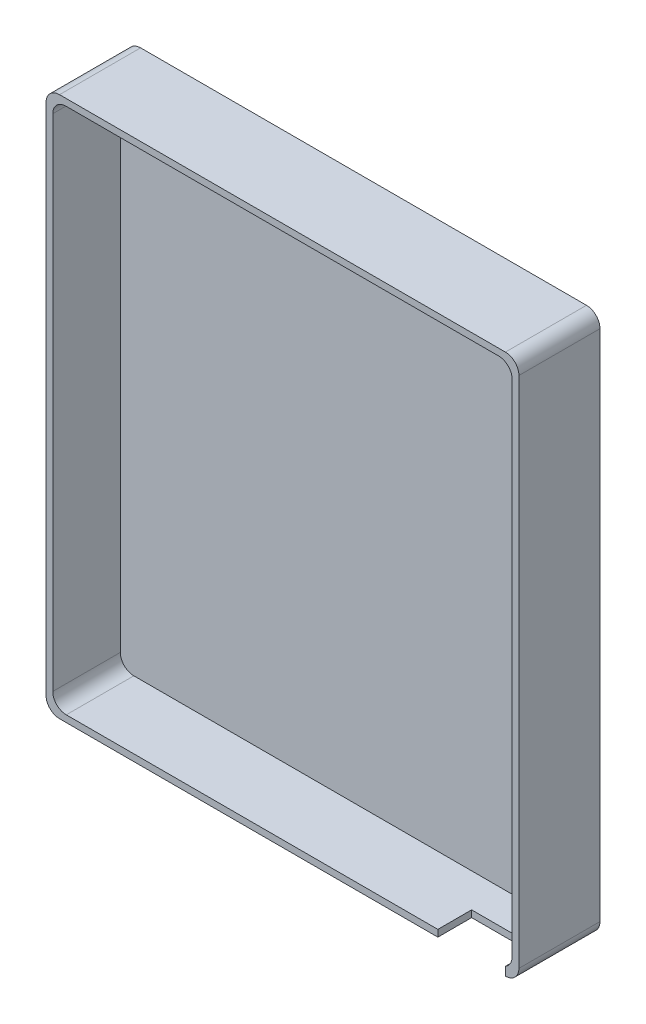
ISO-10303-21;
HEADER;
FILE_DESCRIPTION(('STEP AP214'),'2;1');
FILE_NAME('part.step','',(''),(''),'','','');
FILE_SCHEMA(('AUTOMOTIVE_DESIGN { 1 0 10303 214 1 1 1 1 }'));
ENDSEC;
DATA;
#1=APPLICATION_CONTEXT('core data for automotive mechanical design processes');
#2=APPLICATION_PROTOCOL_DEFINITION('international standard','automotive_design',2000,#1);
#3=PRODUCT_CONTEXT('',#1,'mechanical');
#4=PRODUCT('Part','Part','',(#3));
#5=PRODUCT_RELATED_PRODUCT_CATEGORY('part','',(#4));
#6=PRODUCT_DEFINITION_FORMATION('','',#4);
#7=PRODUCT_DEFINITION_CONTEXT('part definition',#1,'design');
#8=PRODUCT_DEFINITION('design','',#6,#7);
#9=PRODUCT_DEFINITION_SHAPE('','',#8);
#10=(LENGTH_UNIT() NAMED_UNIT(*) SI_UNIT(.MILLI.,.METRE.));
#11=(NAMED_UNIT(*) PLANE_ANGLE_UNIT() SI_UNIT($,.RADIAN.));
#12=(NAMED_UNIT(*) SI_UNIT($,.STERADIAN.) SOLID_ANGLE_UNIT());
#13=UNCERTAINTY_MEASURE_WITH_UNIT(LENGTH_MEASURE(1.E-05),#10,'distance_accuracy_value','');
#14=(GEOMETRIC_REPRESENTATION_CONTEXT(3) GLOBAL_UNCERTAINTY_ASSIGNED_CONTEXT((#13)) GLOBAL_UNIT_ASSIGNED_CONTEXT((#10,
#11,#12)) REPRESENTATION_CONTEXT('',''));
#15=CARTESIAN_POINT('',(0.,0.,0.));
#16=DIRECTION('',(0.,0.,1.));
#17=DIRECTION('',(1.,0.,0.));
#18=AXIS2_PLACEMENT_3D('',#15,#16,#17);
#19=CARTESIAN_POINT('',(0.,0.,2.54));
#20=DIRECTION('',(0.,0.,1.));
#21=DIRECTION('',(1.,0.,0.));
#22=AXIS2_PLACEMENT_3D('',#19,#20,#21);
#23=PLANE('',#22);
#24=CARTESIAN_POINT('',(3.74138412618867,97.8586158738113,2.54));
#25=DIRECTION('',(0.,0.,1.));
#26=DIRECTION('',(1.,0.,0.));
#27=AXIS2_PLACEMENT_3D('',#24,#25,#26);
#28=CIRCLE('',#27,2.47138412618867);
#29=CARTESIAN_POINT('',(1.27,97.8586158738113,2.54));
#30=VERTEX_POINT('',#29);
#31=CARTESIAN_POINT('',(3.74138412618869,100.33,2.54));
#32=VERTEX_POINT('',#31);
#33=EDGE_CURVE('E270',#30,#32,#28,.F.);
#34=ORIENTED_EDGE('',*,*,#33,.F.);
#35=DIRECTION('',(0.,-1.,0.));
#36=VECTOR('',#35,1.);
#37=CARTESIAN_POINT('',(1.27,0.,2.54));
#38=LINE('',#37,#36);
#39=CARTESIAN_POINT('',(1.27,3.81000000000002,2.54));
#40=VERTEX_POINT('',#39);
#41=EDGE_CURVE('E294',#30,#40,#38,.T.);
#42=ORIENTED_EDGE('',*,*,#41,.T.);
#43=CARTESIAN_POINT('',(3.81,3.81,2.54));
#44=DIRECTION('',(0.,0.,1.));
#45=DIRECTION('',(1.,0.,0.));
#46=AXIS2_PLACEMENT_3D('',#43,#44,#45);
#47=CIRCLE('',#46,2.54);
#48=CARTESIAN_POINT('',(3.81000000000002,1.27,2.54));
#49=VERTEX_POINT('',#48);
#50=EDGE_CURVE('E297',#40,#49,#47,.T.);
#51=ORIENTED_EDGE('',*,*,#50,.T.);
#52=DIRECTION('',(1.,0.,0.));
#53=VECTOR('',#52,1.);
#54=CARTESIAN_POINT('',(0.,1.27,2.54));
#55=LINE('',#54,#53);
#56=CARTESIAN_POINT('',(85.09,1.27,2.54));
#57=VERTEX_POINT('',#56);
#58=EDGE_CURVE('E300',#49,#57,#55,.T.);
#59=ORIENTED_EDGE('',*,*,#58,.T.);
#60=CARTESIAN_POINT('',(85.09,3.81,2.54));
#61=DIRECTION('',(0.,0.,1.));
#62=DIRECTION('',(1.,0.,0.));
#63=AXIS2_PLACEMENT_3D('',#60,#61,#62);
#64=CIRCLE('',#63,2.54);
#65=CARTESIAN_POINT('',(87.63,3.81000000000002,2.54));
#66=VERTEX_POINT('',#65);
#67=EDGE_CURVE('E303',#57,#66,#64,.T.);
#68=ORIENTED_EDGE('',*,*,#67,.T.);
#69=DIRECTION('',(0.,1.,0.));
#70=VECTOR('',#69,1.);
#71=CARTESIAN_POINT('',(87.63,0.,2.54));
#72=LINE('',#71,#70);
#73=CARTESIAN_POINT('',(87.63,97.79,2.54));
#74=VERTEX_POINT('',#73);
#75=EDGE_CURVE('E306',#66,#74,#72,.T.);
#76=ORIENTED_EDGE('',*,*,#75,.T.);
#77=CARTESIAN_POINT('',(85.09,97.79,2.54));
#78=DIRECTION('',(0.,0.,1.));
#79=DIRECTION('',(1.,0.,0.));
#80=AXIS2_PLACEMENT_3D('',#77,#78,#79);
#81=CIRCLE('',#80,2.54);
#82=CARTESIAN_POINT('',(85.09,100.33,2.54));
#83=VERTEX_POINT('',#82);
#84=EDGE_CURVE('E309',#74,#83,#81,.T.);
#85=ORIENTED_EDGE('',*,*,#84,.T.);
#86=DIRECTION('',(-1.,0.,0.));
#87=VECTOR('',#86,1.);
#88=CARTESIAN_POINT('',(0.,100.33,2.54));
#89=LINE('',#88,#87);
#90=EDGE_CURVE('E178',#83,#32,#89,.T.);
#91=ORIENTED_EDGE('',*,*,#90,.T.);
#92=EDGE_LOOP('',(#34,#42,#51,#59,#68,#76,#85,#91));
#93=FACE_BOUND('',#92,.T.);
#94=ADVANCED_FACE('F38',(#93),#23,.T.);
#95=CARTESIAN_POINT('',(1.27,0.,15.24));
#96=DIRECTION('',(1.,0.,0.));
#97=DIRECTION('',(0.,0.,-1.));
#98=AXIS2_PLACEMENT_3D('',#95,#96,#97);
#99=PLANE('',#98);
#100=DIRECTION('',(0.,0.,-1.));
#101=VECTOR('',#100,1.);
#102=CARTESIAN_POINT('',(1.27,3.81000000000002,15.24));
#103=LINE('',#102,#101);
#104=CARTESIAN_POINT('',(1.27,3.81000000000002,15.24));
#105=VERTEX_POINT('',#104);
#106=EDGE_CURVE('E248',#105,#40,#103,.T.);
#107=ORIENTED_EDGE('',*,*,#106,.T.);
#108=ORIENTED_EDGE('',*,*,#41,.F.);
#109=DIRECTION('',(0.,0.,-1.));
#110=VECTOR('',#109,1.);
#111=CARTESIAN_POINT('',(1.27,97.8586158738113,15.24));
#112=LINE('',#111,#110);
#113=CARTESIAN_POINT('',(1.27,97.8586158738113,15.24));
#114=VERTEX_POINT('',#113);
#115=EDGE_CURVE('E267',#114,#30,#112,.T.);
#116=ORIENTED_EDGE('',*,*,#115,.F.);
#117=DIRECTION('',(0.,-1.,0.));
#118=VECTOR('',#117,1.);
#119=CARTESIAN_POINT('',(1.27,0.,15.24));
#120=LINE('',#119,#118);
#121=EDGE_CURVE('E208',#114,#105,#120,.T.);
#122=ORIENTED_EDGE('',*,*,#121,.T.);
#123=EDGE_LOOP('',(#107,#108,#116,#122));
#124=FACE_BOUND('',#123,.T.);
#125=ADVANCED_FACE('F380',(#124),#99,.T.);
#126=CARTESIAN_POINT('',(3.74138412618867,97.8586158738113,15.24));
#127=DIRECTION('',(0.,0.,-1.));
#128=DIRECTION('',(-1.,0.,0.));
#129=AXIS2_PLACEMENT_3D('',#126,#127,#128);
#130=CYLINDRICAL_SURFACE('',#129,2.47138412618867);
#131=ORIENTED_EDGE('',*,*,#33,.T.);
#132=DIRECTION('',(0.,0.,-1.));
#133=VECTOR('',#132,1.);
#134=CARTESIAN_POINT('',(3.74138412618869,100.33,15.24));
#135=LINE('',#134,#133);
#136=CARTESIAN_POINT('',(3.74138412618869,100.33,15.24));
#137=VERTEX_POINT('',#136);
#138=EDGE_CURVE('E264',#137,#32,#135,.T.);
#139=ORIENTED_EDGE('',*,*,#138,.F.);
#140=CARTESIAN_POINT('',(3.74138412618867,97.8586158738113,15.24));
#141=DIRECTION('',(0.,0.,1.));
#142=DIRECTION('',(1.,0.,0.));
#143=AXIS2_PLACEMENT_3D('',#140,#141,#142);
#144=CIRCLE('',#143,2.47138412618867);
#145=EDGE_CURVE('E211',#114,#137,#144,.F.);
#146=ORIENTED_EDGE('',*,*,#145,.F.);
#147=ORIENTED_EDGE('',*,*,#115,.T.);
#148=EDGE_LOOP('',(#131,#139,#146,#147));
#149=FACE_BOUND('',#148,.T.);
#150=ADVANCED_FACE('F383',(#149),#130,.F.);
#151=CARTESIAN_POINT('',(0.,100.33,15.24));
#152=DIRECTION('',(0.,-1.,0.));
#153=DIRECTION('',(0.,0.,-1.));
#154=AXIS2_PLACEMENT_3D('',#151,#152,#153);
#155=PLANE('',#154);
#156=ORIENTED_EDGE('',*,*,#138,.T.);
#157=ORIENTED_EDGE('',*,*,#90,.F.);
#158=DIRECTION('',(0.,0.,-1.));
#159=VECTOR('',#158,1.);
#160=CARTESIAN_POINT('',(85.09,100.33,15.24));
#161=LINE('',#160,#159);
#162=CARTESIAN_POINT('',(85.09,100.33,15.24));
#163=VERTEX_POINT('',#162);
#164=EDGE_CURVE('E261',#163,#83,#161,.T.);
#165=ORIENTED_EDGE('',*,*,#164,.F.);
#166=DIRECTION('',(-1.,0.,0.));
#167=VECTOR('',#166,1.);
#168=CARTESIAN_POINT('',(0.,100.33,15.24));
#169=LINE('',#168,#167);
#170=EDGE_CURVE('E213',#163,#137,#169,.T.);
#171=ORIENTED_EDGE('',*,*,#170,.T.);
#172=EDGE_LOOP('',(#156,#157,#165,#171));
#173=FACE_BOUND('',#172,.T.);
#174=ADVANCED_FACE('F316',(#173),#155,.T.);
#175=CARTESIAN_POINT('',(85.09,97.79,15.24));
#176=DIRECTION('',(0.,0.,-1.));
#177=DIRECTION('',(-1.,0.,0.));
#178=AXIS2_PLACEMENT_3D('',#175,#176,#177);
#179=CYLINDRICAL_SURFACE('',#178,2.54);
#180=ORIENTED_EDGE('',*,*,#164,.T.);
#181=ORIENTED_EDGE('',*,*,#84,.F.);
#182=DIRECTION('',(0.,0.,-1.));
#183=VECTOR('',#182,1.);
#184=CARTESIAN_POINT('',(87.63,97.79,15.24));
#185=LINE('',#184,#183);
#186=CARTESIAN_POINT('',(87.63,97.79,15.24));
#187=VERTEX_POINT('',#186);
#188=EDGE_CURVE('E258',#187,#74,#185,.T.);
#189=ORIENTED_EDGE('',*,*,#188,.F.);
#190=CARTESIAN_POINT('',(85.09,97.79,15.24));
#191=DIRECTION('',(0.,0.,1.));
#192=DIRECTION('',(1.,0.,0.));
#193=AXIS2_PLACEMENT_3D('',#190,#191,#192);
#194=CIRCLE('',#193,2.54);
#195=EDGE_CURVE('E216',#187,#163,#194,.T.);
#196=ORIENTED_EDGE('',*,*,#195,.T.);
#197=EDGE_LOOP('',(#180,#181,#189,#196));
#198=FACE_BOUND('',#197,.T.);
#199=ADVANCED_FACE('F320',(#198),#179,.F.);
#200=CARTESIAN_POINT('',(87.63,0.,15.24));
#201=DIRECTION('',(-1.,0.,0.));
#202=DIRECTION('',(0.,0.,1.));
#203=AXIS2_PLACEMENT_3D('',#200,#201,#202);
#204=PLANE('',#203);
#205=ORIENTED_EDGE('',*,*,#188,.T.);
#206=ORIENTED_EDGE('',*,*,#75,.F.);
#207=DIRECTION('',(0.,0.,-1.));
#208=VECTOR('',#207,1.);
#209=CARTESIAN_POINT('',(87.63,3.81000000000002,15.24));
#210=LINE('',#209,#208);
#211=CARTESIAN_POINT('',(87.63,3.81000000000002,15.24));
#212=VERTEX_POINT('',#211);
#213=EDGE_CURVE('E255',#212,#66,#210,.T.);
#214=ORIENTED_EDGE('',*,*,#213,.F.);
#215=DIRECTION('',(0.,1.,0.));
#216=VECTOR('',#215,1.);
#217=CARTESIAN_POINT('',(87.63,0.,15.24));
#218=LINE('',#217,#216);
#219=EDGE_CURVE('E219',#212,#187,#218,.T.);
#220=ORIENTED_EDGE('',*,*,#219,.T.);
#221=EDGE_LOOP('',(#205,#206,#214,#220));
#222=FACE_BOUND('',#221,.T.);
#223=ADVANCED_FACE('F326',(#222),#204,.T.);
#224=CARTESIAN_POINT('',(85.09,3.81,15.24));
#225=DIRECTION('',(0.,0.,-1.));
#226=DIRECTION('',(-1.,0.,0.));
#227=AXIS2_PLACEMENT_3D('',#224,#225,#226);
#228=CYLINDRICAL_SURFACE('',#227,2.54);
#229=DIRECTION('',(0.,0.,-1.));
#230=VECTOR('',#229,1.);
#231=CARTESIAN_POINT('',(86.36,1.61029547438753,15.24));
#232=LINE('',#231,#230);
#233=CARTESIAN_POINT('',(86.36,1.61029547438753,15.24));
#234=VERTEX_POINT('',#233);
#235=CARTESIAN_POINT('',(86.36,1.61029547438752,8.89));
#236=VERTEX_POINT('',#235);
#237=EDGE_CURVE('E337',#234,#236,#232,.T.);
#238=ORIENTED_EDGE('',*,*,#237,.F.);
#239=CARTESIAN_POINT('',(85.09,3.81,15.24));
#240=DIRECTION('',(0.,0.,1.));
#241=DIRECTION('',(1.,0.,0.));
#242=AXIS2_PLACEMENT_3D('',#239,#240,#241);
#243=CIRCLE('',#242,2.54);
#244=EDGE_CURVE('E222',#234,#212,#243,.T.);
#245=ORIENTED_EDGE('',*,*,#244,.T.);
#246=ORIENTED_EDGE('',*,*,#213,.T.);
#247=ORIENTED_EDGE('',*,*,#67,.F.);
#248=DIRECTION('',(0.,0.,-1.));
#249=VECTOR('',#248,1.);
#250=CARTESIAN_POINT('',(85.09,1.27,15.24));
#251=LINE('',#250,#249);
#252=CARTESIAN_POINT('',(85.09,1.27,8.89));
#253=VERTEX_POINT('',#252);
#254=EDGE_CURVE('E253',#253,#57,#251,.T.);
#255=ORIENTED_EDGE('',*,*,#254,.F.);
#256=CARTESIAN_POINT('',(85.09,3.81,8.89));
#257=DIRECTION('',(0.,0.,-1.));
#258=DIRECTION('',(-1.,0.,0.));
#259=AXIS2_PLACEMENT_3D('',#256,#257,#258);
#260=CIRCLE('',#259,2.54);
#261=EDGE_CURVE('E233',#236,#253,#260,.T.);
#262=ORIENTED_EDGE('',*,*,#261,.F.);
#263=EDGE_LOOP('',(#238,#245,#246,#247,#255,#262));
#264=FACE_BOUND('',#263,.T.);
#265=ADVANCED_FACE('F330',(#264),#228,.F.);
#266=CARTESIAN_POINT('',(0.,1.27,15.24));
#267=DIRECTION('',(0.,1.,0.));
#268=DIRECTION('',(0.,0.,1.));
#269=AXIS2_PLACEMENT_3D('',#266,#267,#268);
#270=PLANE('',#269);
#271=DIRECTION('',(-1.,0.,0.));
#272=VECTOR('',#271,1.);
#273=CARTESIAN_POINT('',(0.,1.27,8.89));
#274=LINE('',#273,#272);
#275=CARTESIAN_POINT('',(73.66,1.27,8.89));
#276=VERTEX_POINT('',#275);
#277=EDGE_CURVE('E335',#253,#276,#274,.T.);
#278=ORIENTED_EDGE('',*,*,#277,.F.);
#279=ORIENTED_EDGE('',*,*,#254,.T.);
#280=ORIENTED_EDGE('',*,*,#58,.F.);
#281=DIRECTION('',(0.,0.,-1.));
#282=VECTOR('',#281,1.);
#283=CARTESIAN_POINT('',(3.81000000000002,1.27,15.24));
#284=LINE('',#283,#282);
#285=CARTESIAN_POINT('',(3.81000000000002,1.27,15.24));
#286=VERTEX_POINT('',#285);
#287=EDGE_CURVE('E61',#286,#49,#284,.T.);
#288=ORIENTED_EDGE('',*,*,#287,.F.);
#289=DIRECTION('',(1.,0.,0.));
#290=VECTOR('',#289,1.);
#291=CARTESIAN_POINT('',(0.,1.27,15.24));
#292=LINE('',#291,#290);
#293=CARTESIAN_POINT('',(73.66,1.27,15.24));
#294=VERTEX_POINT('',#293);
#295=EDGE_CURVE('E224',#286,#294,#292,.T.);
#296=ORIENTED_EDGE('',*,*,#295,.T.);
#297=DIRECTION('',(0.,0.,1.));
#298=VECTOR('',#297,1.);
#299=CARTESIAN_POINT('',(73.66,1.27,15.24));
#300=LINE('',#299,#298);
#301=EDGE_CURVE('E53',#276,#294,#300,.T.);
#302=ORIENTED_EDGE('',*,*,#301,.F.);
#303=EDGE_LOOP('',(#278,#279,#280,#288,#296,#302));
#304=FACE_BOUND('',#303,.T.);
#305=ADVANCED_FACE('F334',(#304),#270,.T.);
#306=CARTESIAN_POINT('',(0.,0.,15.24));
#307=DIRECTION('',(1.,0.,0.));
#308=DIRECTION('',(0.,0.,-1.));
#309=AXIS2_PLACEMENT_3D('',#306,#307,#308);
#310=PLANE('',#309);
#311=DIRECTION('',(0.,-1.,0.));
#312=VECTOR('',#311,1.);
#313=CARTESIAN_POINT('',(0.,0.,0.));
#314=LINE('',#313,#312);
#315=CARTESIAN_POINT('',(0.,99.06,0.));
#316=VERTEX_POINT('',#315);
#317=CARTESIAN_POINT('',(0.,2.54000000000002,0.));
#318=VERTEX_POINT('',#317);
#319=EDGE_CURVE('E229',#316,#318,#314,.T.);
#320=ORIENTED_EDGE('',*,*,#319,.T.);
#321=DIRECTION('',(0.,0.,-1.));
#322=VECTOR('',#321,1.);
#323=CARTESIAN_POINT('',(0.,2.54000000000002,15.24));
#324=LINE('',#323,#322);
#325=CARTESIAN_POINT('',(0.,2.54000000000002,15.24));
#326=VERTEX_POINT('',#325);
#327=EDGE_CURVE('E251',#326,#318,#324,.T.);
#328=ORIENTED_EDGE('',*,*,#327,.F.);
#329=DIRECTION('',(0.,-1.,0.));
#330=VECTOR('',#329,1.);
#331=CARTESIAN_POINT('',(0.,0.,15.24));
#332=LINE('',#331,#330);
#333=CARTESIAN_POINT('',(0.,99.06,15.24));
#334=VERTEX_POINT('',#333);
#335=EDGE_CURVE('E197',#334,#326,#332,.T.);
#336=ORIENTED_EDGE('',*,*,#335,.F.);
#337=DIRECTION('',(0.,0.,-1.));
#338=VECTOR('',#337,1.);
#339=CARTESIAN_POINT('',(0.,99.06,15.24));
#340=LINE('',#339,#338);
#341=EDGE_CURVE('E228',#334,#316,#340,.T.);
#342=ORIENTED_EDGE('',*,*,#341,.T.);
#343=EDGE_LOOP('',(#320,#328,#336,#342));
#344=FACE_BOUND('',#343,.T.);
#345=ADVANCED_FACE('F348',(#344),#310,.F.);
#346=CARTESIAN_POINT('',(2.54,2.54,15.24));
#347=DIRECTION('',(0.,0.,-1.));
#348=DIRECTION('',(-1.,0.,0.));
#349=AXIS2_PLACEMENT_3D('',#346,#347,#348);
#350=CYLINDRICAL_SURFACE('',#349,2.54);
#351=CARTESIAN_POINT('',(2.54,2.54,0.));
#352=DIRECTION('',(0.,0.,1.));
#353=DIRECTION('',(1.,0.,0.));
#354=AXIS2_PLACEMENT_3D('',#351,#352,#353);
#355=CIRCLE('',#354,2.54);
#356=CARTESIAN_POINT('',(2.54000000000002,0.,0.));
#357=VERTEX_POINT('',#356);
#358=EDGE_CURVE('E232',#318,#357,#355,.T.);
#359=ORIENTED_EDGE('',*,*,#358,.T.);
#360=DIRECTION('',(0.,0.,-1.));
#361=VECTOR('',#360,1.);
#362=CARTESIAN_POINT('',(2.54000000000002,0.,15.24));
#363=LINE('',#362,#361);
#364=CARTESIAN_POINT('',(2.54000000000002,0.,15.24));
#365=VERTEX_POINT('',#364);
#366=EDGE_CURVE('E289',#365,#357,#363,.T.);
#367=ORIENTED_EDGE('',*,*,#366,.F.);
#368=CARTESIAN_POINT('',(2.54,2.54,15.24));
#369=DIRECTION('',(0.,0.,1.));
#370=DIRECTION('',(1.,0.,0.));
#371=AXIS2_PLACEMENT_3D('',#368,#369,#370);
#372=CIRCLE('',#371,2.54);
#373=EDGE_CURVE('E191',#326,#365,#372,.T.);
#374=ORIENTED_EDGE('',*,*,#373,.F.);
#375=ORIENTED_EDGE('',*,*,#327,.T.);
#376=EDGE_LOOP('',(#359,#367,#374,#375));
#377=FACE_BOUND('',#376,.T.);
#378=ADVANCED_FACE('F351',(#377),#350,.T.);
#379=CARTESIAN_POINT('',(0.,0.,15.24));
#380=DIRECTION('',(0.,1.,0.));
#381=DIRECTION('',(0.,0.,1.));
#382=AXIS2_PLACEMENT_3D('',#379,#380,#381);
#383=PLANE('',#382);
#384=DIRECTION('',(0.,0.,-1.));
#385=VECTOR('',#384,1.);
#386=CARTESIAN_POINT('',(86.36,0.,15.24));
#387=LINE('',#386,#385);
#388=CARTESIAN_POINT('',(86.36,0.,8.89));
#389=VERTEX_POINT('',#388);
#390=CARTESIAN_POINT('',(86.36,0.,0.));
#391=VERTEX_POINT('',#390);
#392=EDGE_CURVE('E285',#389,#391,#387,.T.);
#393=ORIENTED_EDGE('',*,*,#392,.F.);
#394=DIRECTION('',(1.,0.,0.));
#395=VECTOR('',#394,1.);
#396=CARTESIAN_POINT('',(73.66,0.,8.89));
#397=LINE('',#396,#395);
#398=CARTESIAN_POINT('',(73.66,0.,8.89));
#399=VERTEX_POINT('',#398);
#400=EDGE_CURVE('E186',#399,#389,#397,.T.);
#401=ORIENTED_EDGE('',*,*,#400,.F.);
#402=DIRECTION('',(0.,0.,-1.));
#403=VECTOR('',#402,1.);
#404=CARTESIAN_POINT('',(73.66,0.,8.89));
#405=LINE('',#404,#403);
#406=CARTESIAN_POINT('',(73.66,0.,15.24));
#407=VERTEX_POINT('',#406);
#408=EDGE_CURVE('E172',#407,#399,#405,.T.);
#409=ORIENTED_EDGE('',*,*,#408,.F.);
#410=DIRECTION('',(1.,0.,0.));
#411=VECTOR('',#410,1.);
#412=CARTESIAN_POINT('',(0.,0.,15.24));
#413=LINE('',#412,#411);
#414=EDGE_CURVE('E184',#365,#407,#413,.T.);
#415=ORIENTED_EDGE('',*,*,#414,.F.);
#416=ORIENTED_EDGE('',*,*,#366,.T.);
#417=DIRECTION('',(1.,0.,0.));
#418=VECTOR('',#417,1.);
#419=CARTESIAN_POINT('',(0.,0.,0.));
#420=LINE('',#419,#418);
#421=EDGE_CURVE('E235',#357,#391,#420,.T.);
#422=ORIENTED_EDGE('',*,*,#421,.T.);
#423=EDGE_LOOP('',(#393,#401,#409,#415,#416,#422));
#424=FACE_BOUND('',#423,.T.);
#425=ADVANCED_FACE('F182',(#424),#383,.F.);
#426=CARTESIAN_POINT('',(86.36,2.54,15.24));
#427=DIRECTION('',(0.,0.,-1.));
#428=DIRECTION('',(-1.,0.,0.));
#429=AXIS2_PLACEMENT_3D('',#426,#427,#428);
#430=CYLINDRICAL_SURFACE('',#429,2.54);
#431=CARTESIAN_POINT('',(86.36,2.54,0.));
#432=DIRECTION('',(0.,0.,1.));
#433=DIRECTION('',(1.,0.,0.));
#434=AXIS2_PLACEMENT_3D('',#431,#432,#433);
#435=CIRCLE('',#434,2.54);
#436=CARTESIAN_POINT('',(88.9,2.54000000000002,0.));
#437=VERTEX_POINT('',#436);
#438=EDGE_CURVE('E238',#391,#437,#435,.T.);
#439=ORIENTED_EDGE('',*,*,#438,.T.);
#440=DIRECTION('',(0.,0.,-1.));
#441=VECTOR('',#440,1.);
#442=CARTESIAN_POINT('',(88.9,2.54000000000002,15.24));
#443=LINE('',#442,#441);
#444=CARTESIAN_POINT('',(88.9,2.54000000000002,15.24));
#445=VERTEX_POINT('',#444);
#446=EDGE_CURVE('E282',#445,#437,#443,.T.);
#447=ORIENTED_EDGE('',*,*,#446,.F.);
#448=CARTESIAN_POINT('',(86.36,2.54,15.24));
#449=DIRECTION('',(0.,0.,1.));
#450=DIRECTION('',(1.,0.,0.));
#451=AXIS2_PLACEMENT_3D('',#448,#449,#450);
#452=CIRCLE('',#451,2.54);
#453=CARTESIAN_POINT('',(86.36,0.,15.24));
#454=VERTEX_POINT('',#453);
#455=EDGE_CURVE('E193',#454,#445,#452,.T.);
#456=ORIENTED_EDGE('',*,*,#455,.F.);
#457=EDGE_CURVE('E286',#454,#389,#387,.T.);
#458=ORIENTED_EDGE('',*,*,#457,.T.);
#459=ORIENTED_EDGE('',*,*,#392,.T.);
#460=EDGE_LOOP('',(#439,#447,#456,#458,#459));
#461=FACE_BOUND('',#460,.T.);
#462=ADVANCED_FACE('F359',(#461),#430,.T.);
#463=CARTESIAN_POINT('',(88.9,0.,15.24));
#464=DIRECTION('',(-1.,0.,0.));
#465=DIRECTION('',(0.,0.,1.));
#466=AXIS2_PLACEMENT_3D('',#463,#464,#465);
#467=PLANE('',#466);
#468=DIRECTION('',(0.,1.,0.));
#469=VECTOR('',#468,1.);
#470=CARTESIAN_POINT('',(88.9,0.,0.));
#471=LINE('',#470,#469);
#472=CARTESIAN_POINT('',(88.9,99.06,0.));
#473=VERTEX_POINT('',#472);
#474=EDGE_CURVE('E240',#437,#473,#471,.T.);
#475=ORIENTED_EDGE('',*,*,#474,.T.);
#476=DIRECTION('',(0.,0.,-1.));
#477=VECTOR('',#476,1.);
#478=CARTESIAN_POINT('',(88.9,99.06,15.24));
#479=LINE('',#478,#477);
#480=CARTESIAN_POINT('',(88.9,99.06,15.24));
#481=VERTEX_POINT('',#480);
#482=EDGE_CURVE('E279',#481,#473,#479,.T.);
#483=ORIENTED_EDGE('',*,*,#482,.F.);
#484=DIRECTION('',(0.,1.,0.));
#485=VECTOR('',#484,1.);
#486=CARTESIAN_POINT('',(88.9,0.,15.24));
#487=LINE('',#486,#485);
#488=EDGE_CURVE('E195',#445,#481,#487,.T.);
#489=ORIENTED_EDGE('',*,*,#488,.F.);
#490=ORIENTED_EDGE('',*,*,#446,.T.);
#491=EDGE_LOOP('',(#475,#483,#489,#490));
#492=FACE_BOUND('',#491,.T.);
#493=ADVANCED_FACE('F363',(#492),#467,.F.);
#494=CARTESIAN_POINT('',(86.36,99.06,15.24));
#495=DIRECTION('',(0.,0.,-1.));
#496=DIRECTION('',(-1.,0.,0.));
#497=AXIS2_PLACEMENT_3D('',#494,#495,#496);
#498=CYLINDRICAL_SURFACE('',#497,2.54);
#499=CARTESIAN_POINT('',(86.36,99.06,0.));
#500=DIRECTION('',(0.,0.,1.));
#501=DIRECTION('',(1.,0.,0.));
#502=AXIS2_PLACEMENT_3D('',#499,#500,#501);
#503=CIRCLE('',#502,2.54);
#504=CARTESIAN_POINT('',(86.36,101.6,0.));
#505=VERTEX_POINT('',#504);
#506=EDGE_CURVE('E242',#473,#505,#503,.T.);
#507=ORIENTED_EDGE('',*,*,#506,.T.);
#508=DIRECTION('',(0.,0.,-1.));
#509=VECTOR('',#508,1.);
#510=CARTESIAN_POINT('',(86.36,101.6,15.24));
#511=LINE('',#510,#509);
#512=CARTESIAN_POINT('',(86.36,101.6,15.24));
#513=VERTEX_POINT('',#512);
#514=EDGE_CURVE('E276',#513,#505,#511,.T.);
#515=ORIENTED_EDGE('',*,*,#514,.F.);
#516=CARTESIAN_POINT('',(86.36,99.06,15.24));
#517=DIRECTION('',(0.,0.,1.));
#518=DIRECTION('',(1.,0.,0.));
#519=AXIS2_PLACEMENT_3D('',#516,#517,#518);
#520=CIRCLE('',#519,2.54);
#521=EDGE_CURVE('E202',#481,#513,#520,.T.);
#522=ORIENTED_EDGE('',*,*,#521,.F.);
#523=ORIENTED_EDGE('',*,*,#482,.T.);
#524=EDGE_LOOP('',(#507,#515,#522,#523));
#525=FACE_BOUND('',#524,.T.);
#526=ADVANCED_FACE('F406',(#525),#498,.T.);
#527=CARTESIAN_POINT('',(0.,101.6,15.24));
#528=DIRECTION('',(0.,-1.,0.));
#529=DIRECTION('',(0.,0.,-1.));
#530=AXIS2_PLACEMENT_3D('',#527,#528,#529);
#531=PLANE('',#530);
#532=DIRECTION('',(-1.,0.,0.));
#533=VECTOR('',#532,1.);
#534=CARTESIAN_POINT('',(0.,101.6,0.));
#535=LINE('',#534,#533);
#536=CARTESIAN_POINT('',(2.54000000000002,101.6,0.));
#537=VERTEX_POINT('',#536);
#538=EDGE_CURVE('E244',#505,#537,#535,.T.);
#539=ORIENTED_EDGE('',*,*,#538,.T.);
#540=DIRECTION('',(0.,0.,-1.));
#541=VECTOR('',#540,1.);
#542=CARTESIAN_POINT('',(2.54000000000002,101.6,15.24));
#543=LINE('',#542,#541);
#544=CARTESIAN_POINT('',(2.54000000000002,101.6,15.24));
#545=VERTEX_POINT('',#544);
#546=EDGE_CURVE('E273',#545,#537,#543,.T.);
#547=ORIENTED_EDGE('',*,*,#546,.F.);
#548=DIRECTION('',(-1.,0.,0.));
#549=VECTOR('',#548,1.);
#550=CARTESIAN_POINT('',(0.,101.6,15.24));
#551=LINE('',#550,#549);
#552=EDGE_CURVE('E204',#513,#545,#551,.T.);
#553=ORIENTED_EDGE('',*,*,#552,.F.);
#554=ORIENTED_EDGE('',*,*,#514,.T.);
#555=EDGE_LOOP('',(#539,#547,#553,#554));
#556=FACE_BOUND('',#555,.T.);
#557=ADVANCED_FACE('F409',(#556),#531,.F.);
#558=CARTESIAN_POINT('',(2.54,99.06,15.24));
#559=DIRECTION('',(0.,0.,-1.));
#560=DIRECTION('',(-1.,0.,0.));
#561=AXIS2_PLACEMENT_3D('',#558,#559,#560);
#562=CYLINDRICAL_SURFACE('',#561,2.54);
#563=CARTESIAN_POINT('',(2.54,99.06,0.));
#564=DIRECTION('',(0.,0.,1.));
#565=DIRECTION('',(1.,0.,0.));
#566=AXIS2_PLACEMENT_3D('',#563,#564,#565);
#567=CIRCLE('',#566,2.54);
#568=EDGE_CURVE('E246',#537,#316,#567,.T.);
#569=ORIENTED_EDGE('',*,*,#568,.T.);
#570=ORIENTED_EDGE('',*,*,#341,.F.);
#571=CARTESIAN_POINT('',(2.54,99.06,15.24));
#572=DIRECTION('',(0.,0.,1.));
#573=DIRECTION('',(1.,0.,0.));
#574=AXIS2_PLACEMENT_3D('',#571,#572,#573);
#575=CIRCLE('',#574,2.54);
#576=EDGE_CURVE('E206',#545,#334,#575,.T.);
#577=ORIENTED_EDGE('',*,*,#576,.F.);
#578=ORIENTED_EDGE('',*,*,#546,.T.);
#579=EDGE_LOOP('',(#569,#570,#577,#578));
#580=FACE_BOUND('',#579,.T.);
#581=ADVANCED_FACE('F413',(#580),#562,.T.);
#582=CARTESIAN_POINT('',(3.81,3.81,15.24));
#583=DIRECTION('',(0.,0.,-1.));
#584=DIRECTION('',(-1.,0.,0.));
#585=AXIS2_PLACEMENT_3D('',#582,#583,#584);
#586=CYLINDRICAL_SURFACE('',#585,2.54);
#587=ORIENTED_EDGE('',*,*,#287,.T.);
#588=ORIENTED_EDGE('',*,*,#50,.F.);
#589=ORIENTED_EDGE('',*,*,#106,.F.);
#590=CARTESIAN_POINT('',(3.81,3.81,15.24));
#591=DIRECTION('',(0.,0.,1.));
#592=DIRECTION('',(1.,0.,0.));
#593=AXIS2_PLACEMENT_3D('',#590,#591,#592);
#594=CIRCLE('',#593,2.54);
#595=EDGE_CURVE('E226',#105,#286,#594,.T.);
#596=ORIENTED_EDGE('',*,*,#595,.T.);
#597=EDGE_LOOP('',(#587,#588,#589,#596));
#598=FACE_BOUND('',#597,.T.);
#599=ADVANCED_FACE('F378',(#598),#586,.F.);
#600=CARTESIAN_POINT('',(0.,0.,15.24));
#601=DIRECTION('',(0.,0.,1.));
#602=DIRECTION('',(1.,0.,0.));
#603=AXIS2_PLACEMENT_3D('',#600,#601,#602);
#604=PLANE('',#603);
#605=DIRECTION('',(0.,1.,0.));
#606=VECTOR('',#605,1.);
#607=CARTESIAN_POINT('',(86.36,0.,15.24));
#608=LINE('',#607,#606);
#609=EDGE_CURVE('E11',#454,#234,#608,.T.);
#610=ORIENTED_EDGE('',*,*,#609,.F.);
#611=ORIENTED_EDGE('',*,*,#455,.T.);
#612=ORIENTED_EDGE('',*,*,#488,.T.);
#613=ORIENTED_EDGE('',*,*,#521,.T.);
#614=ORIENTED_EDGE('',*,*,#552,.T.);
#615=ORIENTED_EDGE('',*,*,#576,.T.);
#616=ORIENTED_EDGE('',*,*,#335,.T.);
#617=ORIENTED_EDGE('',*,*,#373,.T.);
#618=ORIENTED_EDGE('',*,*,#414,.T.);
#619=DIRECTION('',(0.,-1.,0.));
#620=VECTOR('',#619,1.);
#621=CARTESIAN_POINT('',(73.66,0.,15.24));
#622=LINE('',#621,#620);
#623=EDGE_CURVE('E46',#294,#407,#622,.T.);
#624=ORIENTED_EDGE('',*,*,#623,.F.);
#625=ORIENTED_EDGE('',*,*,#295,.F.);
#626=ORIENTED_EDGE('',*,*,#595,.F.);
#627=ORIENTED_EDGE('',*,*,#121,.F.);
#628=ORIENTED_EDGE('',*,*,#145,.T.);
#629=ORIENTED_EDGE('',*,*,#170,.F.);
#630=ORIENTED_EDGE('',*,*,#195,.F.);
#631=ORIENTED_EDGE('',*,*,#219,.F.);
#632=ORIENTED_EDGE('',*,*,#244,.F.);
#633=EDGE_LOOP('',(#610,#611,#612,#613,#614,#615,#616,#617,#618,#624,#625,#626,#627,#628,#629,
#630,#631,#632));
#634=FACE_BOUND('',#633,.T.);
#635=ADVANCED_FACE('F189',(#634),#604,.T.);
#636=CARTESIAN_POINT('',(0.,0.,0.));
#637=DIRECTION('',(0.,0.,1.));
#638=DIRECTION('',(1.,0.,0.));
#639=AXIS2_PLACEMENT_3D('',#636,#637,#638);
#640=PLANE('',#639);
#641=ORIENTED_EDGE('',*,*,#319,.F.);
#642=ORIENTED_EDGE('',*,*,#568,.F.);
#643=ORIENTED_EDGE('',*,*,#538,.F.);
#644=ORIENTED_EDGE('',*,*,#506,.F.);
#645=ORIENTED_EDGE('',*,*,#474,.F.);
#646=ORIENTED_EDGE('',*,*,#438,.F.);
#647=ORIENTED_EDGE('',*,*,#421,.F.);
#648=ORIENTED_EDGE('',*,*,#358,.F.);
#649=EDGE_LOOP('',(#641,#642,#643,#644,#645,#646,#647,#648));
#650=FACE_BOUND('',#649,.T.);
#651=ADVANCED_FACE('F40',(#650),#640,.F.);
#652=CARTESIAN_POINT('',(86.36,2.54,15.24));
#653=DIRECTION('',(1.,0.,0.));
#654=DIRECTION('',(0.,0.,-1.));
#655=AXIS2_PLACEMENT_3D('',#652,#653,#654);
#656=PLANE('',#655);
#657=ORIENTED_EDGE('',*,*,#237,.T.);
#658=DIRECTION('',(0.,-1.,0.));
#659=VECTOR('',#658,1.);
#660=CARTESIAN_POINT('',(86.36,2.54,8.89));
#661=LINE('',#660,#659);
#662=EDGE_CURVE('E369',#236,#389,#661,.T.);
#663=ORIENTED_EDGE('',*,*,#662,.T.);
#664=ORIENTED_EDGE('',*,*,#457,.F.);
#665=ORIENTED_EDGE('',*,*,#609,.T.);
#666=EDGE_LOOP('',(#657,#663,#664,#665));
#667=FACE_BOUND('',#666,.T.);
#668=ADVANCED_FACE('F368',(#667),#656,.F.);
#669=CARTESIAN_POINT('',(73.66,2.54,8.89));
#670=DIRECTION('',(0.,0.,-1.));
#671=DIRECTION('',(-1.,0.,0.));
#672=AXIS2_PLACEMENT_3D('',#669,#670,#671);
#673=PLANE('',#672);
#674=ORIENTED_EDGE('',*,*,#261,.T.);
#675=ORIENTED_EDGE('',*,*,#277,.T.);
#676=DIRECTION('',(0.,-1.,0.));
#677=VECTOR('',#676,1.);
#678=CARTESIAN_POINT('',(73.66,2.54,8.89));
#679=LINE('',#678,#677);
#680=EDGE_CURVE('E370',#276,#399,#679,.T.);
#681=ORIENTED_EDGE('',*,*,#680,.T.);
#682=ORIENTED_EDGE('',*,*,#400,.T.);
#683=ORIENTED_EDGE('',*,*,#662,.F.);
#684=EDGE_LOOP('',(#674,#675,#681,#682,#683));
#685=FACE_BOUND('',#684,.T.);
#686=ADVANCED_FACE('F372',(#685),#673,.F.);
#687=CARTESIAN_POINT('',(73.66,2.54,8.89));
#688=DIRECTION('',(-1.,0.,0.));
#689=DIRECTION('',(0.,0.,1.));
#690=AXIS2_PLACEMENT_3D('',#687,#688,#689);
#691=PLANE('',#690);
#692=ORIENTED_EDGE('',*,*,#301,.T.);
#693=ORIENTED_EDGE('',*,*,#623,.T.);
#694=ORIENTED_EDGE('',*,*,#408,.T.);
#695=ORIENTED_EDGE('',*,*,#680,.F.);
#696=EDGE_LOOP('',(#692,#693,#694,#695));
#697=FACE_BOUND('',#696,.T.);
#698=ADVANCED_FACE('F171',(#697),#691,.F.);
#699=CLOSED_SHELL('',(#94,#125,#150,#174,#199,#223,#265,#305,#345,#378,#425,#462,#493,#526,#557,
#581,#599,#635,#651,#668,#686,#698));
#700=MANIFOLD_SOLID_BREP('B2',#699);
#701=ADVANCED_BREP_SHAPE_REPRESENTATION('',(#18,#700),#14);
#702=SHAPE_DEFINITION_REPRESENTATION(#9,#701);
ENDSEC;
END-ISO-10303-21;
